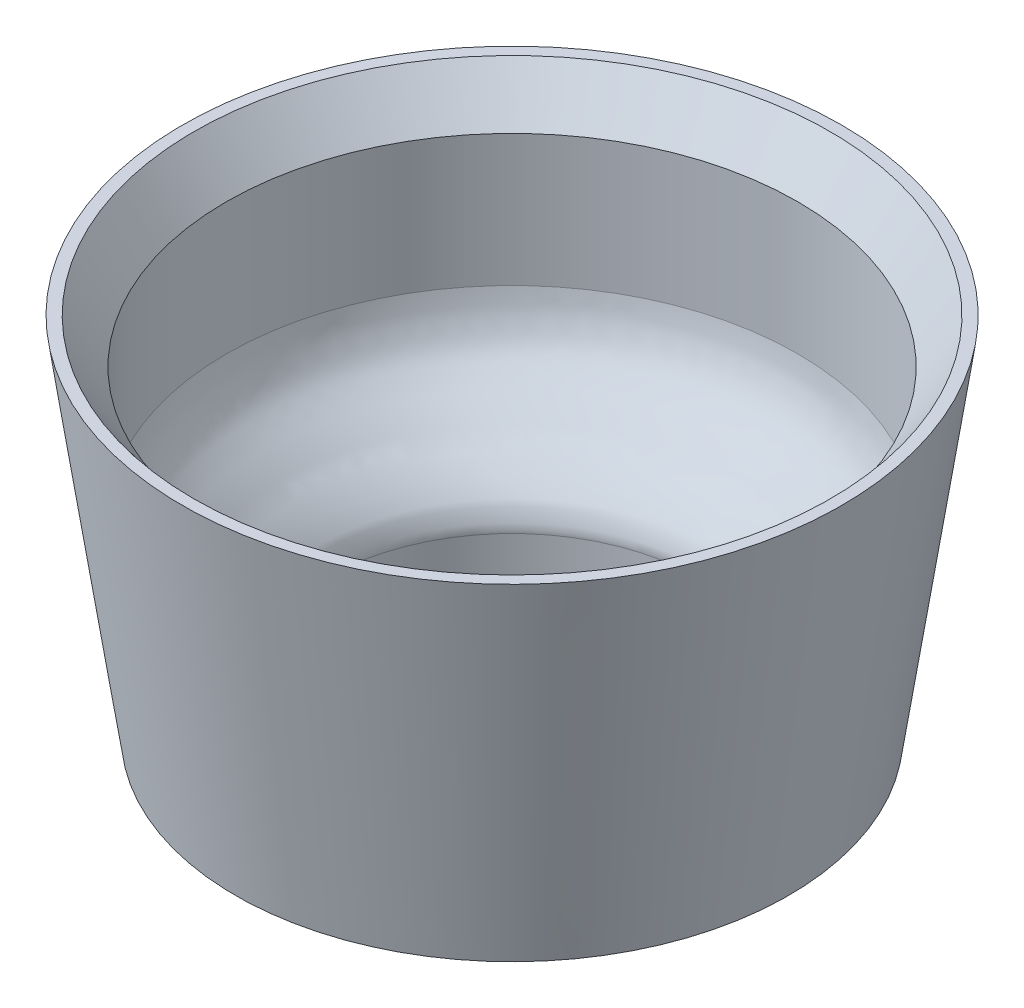
ISO-10303-21;
HEADER;
FILE_DESCRIPTION(('STEP AP214'),'2;1');
FILE_NAME('part.step','',(''),(''),'','','');
FILE_SCHEMA(('AUTOMOTIVE_DESIGN { 1 0 10303 214 1 1 1 1 }'));
ENDSEC;
DATA;
#1=APPLICATION_CONTEXT('core data for automotive mechanical design processes');
#2=APPLICATION_PROTOCOL_DEFINITION('international standard','automotive_design',2000,#1);
#3=PRODUCT_CONTEXT('',#1,'mechanical');
#4=PRODUCT('Part','Part','',(#3));
#5=PRODUCT_RELATED_PRODUCT_CATEGORY('part','',(#4));
#6=PRODUCT_DEFINITION_FORMATION('','',#4);
#7=PRODUCT_DEFINITION_CONTEXT('part definition',#1,'design');
#8=PRODUCT_DEFINITION('design','',#6,#7);
#9=PRODUCT_DEFINITION_SHAPE('','',#8);
#10=(LENGTH_UNIT() NAMED_UNIT(*) SI_UNIT(.MILLI.,.METRE.));
#11=(NAMED_UNIT(*) PLANE_ANGLE_UNIT() SI_UNIT($,.RADIAN.));
#12=(NAMED_UNIT(*) SI_UNIT($,.STERADIAN.) SOLID_ANGLE_UNIT());
#13=UNCERTAINTY_MEASURE_WITH_UNIT(LENGTH_MEASURE(1.E-05),#10,'distance_accuracy_value','');
#14=(GEOMETRIC_REPRESENTATION_CONTEXT(3) GLOBAL_UNCERTAINTY_ASSIGNED_CONTEXT((#13)) GLOBAL_UNIT_ASSIGNED_CONTEXT((#10,
#11,#12)) REPRESENTATION_CONTEXT('',''));
#15=CARTESIAN_POINT('',(0.,0.,0.));
#16=DIRECTION('',(0.,0.,1.));
#17=DIRECTION('',(1.,0.,0.));
#18=AXIS2_PLACEMENT_3D('',#15,#16,#17);
#19=CARTESIAN_POINT('',(0.,295.540718441883,-40.5476747547925));
#20=CARTESIAN_POINT('',(0.,295.012709619523,-40.4477404661589));
#21=CARTESIAN_POINT('',(0.,293.97075762208,-40.2927773532569));
#22=CARTESIAN_POINT('',(0.,292.587532756122,-39.9308897560611));
#23=CARTESIAN_POINT('',(0.,291.58145136226,-39.5161864167623));
#24=CARTESIAN_POINT('',(0.,290.578047282884,-39.108370783691));
#25=CARTESIAN_POINT('',(0.,289.316986820611,-38.4396980559672));
#26=CARTESIAN_POINT('',(0.,288.032583080572,-37.331416088062));
#27=CARTESIAN_POINT('',(0.,287.115418475381,-36.3683638828485));
#28=CARTESIAN_POINT('',(0.,286.340079674161,-35.6302312659731));
#29=CARTESIAN_POINT('',(0.,285.762737127398,-35.016472727917));
#30=CARTESIAN_POINT('',(0.,285.24716922452,-34.3942597967322));
#31=CARTESIAN_POINT('',(0.,284.556558000638,-33.6355246627479));
#32=CARTESIAN_POINT('',(0.,283.771384038908,-32.9203613347517));
#33=CARTESIAN_POINT('',(0.,282.986073937038,-32.1296519022716));
#34=CARTESIAN_POINT('',(0.,282.459482323663,-31.4852417847114));
#35=CARTESIAN_POINT('',(0.,281.963476573619,-30.9149972093189));
#36=CARTESIAN_POINT('',(0.,281.391298159735,-30.3717003470602));
#37=CARTESIAN_POINT('',(0.,280.804626850674,-29.7827961595503));
#38=CARTESIAN_POINT('',(0.,280.262154528678,-29.2275845818967));
#39=CARTESIAN_POINT('',(0.,279.674853682106,-28.7247526186086));
#40=CARTESIAN_POINT('',(0.,279.039651715806,-28.180386253933));
#41=CARTESIAN_POINT('',(0.,278.470209992177,-27.6518383156236));
#42=CARTESIAN_POINT('',(0.,277.876839187046,-27.3081459356275));
#43=CARTESIAN_POINT('',(0.,277.127164256489,-26.995230080683));
#44=CARTESIAN_POINT('',(0.,276.164510632416,-26.5979526177772));
#45=CARTESIAN_POINT('',(0.,275.470548140739,-26.4648115829102));
#46=CARTESIAN_POINT('',(0.,274.996982716808,-26.5077562004189));
#47=B_SPLINE_CURVE_WITH_KNOTS('',3,(#19,#20,#21,#22,#23,#24,#25,#26,#27,#28,#29,#30,#31,#32,#33,
#34,#35,#36,#37,#38,#39,#40,#41,#42,#43,#44,#45,#46),.UNSPECIFIED.,.F.,.F.,(4,1,1,1,1,1,1,1,1,1,
1,1,1,1,1,1,1,1,1,1,1,1,1,1,1,4),(0.,0.0625440482121065,0.125088096424213,0.156360120530266,
0.187632144636319,0.250176192848426,0.312720241060532,0.375264289272639,0.406536313378692,
0.437808337484745,0.469080361590798,0.500352385696852,0.562896433908958,0.594168458015011,
0.625440482121065,0.656712506227118,0.687984530333171,0.719256554439224,0.750528578545278,
0.781800602651331,0.813072626757384,0.844344650863437,0.87561667496949,0.906888699075544,
0.938160723181597,1.0007047713937),.UNSPECIFIED.);
#48=CARTESIAN_POINT('',(0.,0.,0.));
#49=DIRECTION('',(0.,-1.,0.));
#50=AXIS1_PLACEMENT('',#48,#49);
#51=SURFACE_OF_REVOLUTION('',#47,#50);
#52=CARTESIAN_POINT('',(0.,274.996982716808,8.70010388948478E-13));
#53=DIRECTION('',(0.,-1.,0.));
#54=DIRECTION('',(0.,0.,-1.));
#55=AXIS2_PLACEMENT_3D('',#52,#53,#54);
#56=CIRCLE('',#55,26.5077562004197);
#57=CARTESIAN_POINT('',(0.,274.996982716808,-26.5077562004189));
#58=VERTEX_POINT('',#57);
#59=EDGE_CURVE('E52',#58,#58,#56,.T.);
#60=ORIENTED_EDGE('',*,*,#59,.T.);
#61=EDGE_LOOP('',(#60));
#62=FACE_BOUND('',#61,.T.);
#63=CARTESIAN_POINT('',(0.,295.540718441883,9.35004787548966E-13));
#64=DIRECTION('',(0.,-1.,0.));
#65=DIRECTION('',(0.,0.,-1.));
#66=AXIS2_PLACEMENT_3D('',#63,#64,#65);
#67=CIRCLE('',#66,40.5476747547934);
#68=CARTESIAN_POINT('',(0.,295.540718441883,-40.5476747547925));
#69=VERTEX_POINT('',#68);
#70=EDGE_CURVE('E10',#69,#69,#67,.T.);
#71=ORIENTED_EDGE('',*,*,#70,.F.);
#72=EDGE_LOOP('',(#71));
#73=FACE_BOUND('',#72,.T.);
#74=ADVANCED_FACE('F32',(#62,#73),#51,.F.);
#75=CARTESIAN_POINT('',(0.,0.,0.));
#76=DIRECTION('',(0.,-1.,0.));
#77=DIRECTION('',(0.,0.,-1.));
#78=AXIS2_PLACEMENT_3D('',#75,#76,#77);
#79=CYLINDRICAL_SURFACE('',#78,40.5476747547935);
#80=CARTESIAN_POINT('',(0.,314.23861894093,1.21639691948947E-12));
#81=DIRECTION('',(0.,1.,0.));
#82=DIRECTION('',(0.,0.,1.));
#83=AXIS2_PLACEMENT_3D('',#80,#81,#82);
#84=CIRCLE('',#83,40.5476747547937);
#85=CARTESIAN_POINT('',(0.,314.238618940931,40.5476747547949));
#86=VERTEX_POINT('',#85);
#87=EDGE_CURVE('E58',#86,#86,#84,.T.);
#88=ORIENTED_EDGE('',*,*,#87,.T.);
#89=EDGE_LOOP('',(#88));
#90=FACE_BOUND('',#89,.T.);
#91=ORIENTED_EDGE('',*,*,#70,.T.);
#92=EDGE_LOOP('',(#91));
#93=FACE_BOUND('',#92,.T.);
#94=ADVANCED_FACE('F83',(#90,#93),#79,.F.);
#95=CARTESIAN_POINT('',(0.,320.561079728492,-44.1979491924324));
#96=DIRECTION('',(0.,1.,0.));
#97=DIRECTION('',(0.,0.,1.));
#98=AXIS2_PLACEMENT_3D('',#95,#96,#97);
#99=PLANE('',#98);
#100=CARTESIAN_POINT('',(0.,320.561079728492,1.83522502169681E-12));
#101=DIRECTION('',(0.,1.,0.));
#102=DIRECTION('',(0.,0.,1.));
#103=AXIS2_PLACEMENT_3D('',#100,#101,#102);
#104=CIRCLE('',#103,45.1412113986033);
#105=CARTESIAN_POINT('',(0.,320.561079728491,45.1412113986051));
#106=VERTEX_POINT('',#105);
#107=EDGE_CURVE('E36',#106,#106,#104,.F.);
#108=ORIENTED_EDGE('',*,*,#107,.T.);
#109=EDGE_LOOP('',(#108));
#110=FACE_BOUND('',#109,.T.);
#111=CARTESIAN_POINT('',(0.,320.561079728492,1.01416192607296E-12));
#112=DIRECTION('',(0.,-1.,0.));
#113=DIRECTION('',(0.,0.,-1.));
#114=AXIS2_PLACEMENT_3D('',#111,#112,#113);
#115=CIRCLE('',#114,46.7648040804644);
#116=CARTESIAN_POINT('',(0.,320.561079728492,-46.7648040804634));
#117=VERTEX_POINT('',#116);
#118=EDGE_CURVE('E40',#117,#117,#115,.T.);
#119=ORIENTED_EDGE('',*,*,#118,.F.);
#120=EDGE_LOOP('',(#119));
#121=FACE_BOUND('',#120,.T.);
#122=ADVANCED_FACE('F68',(#110,#121),#99,.T.);
#123=CARTESIAN_POINT('',(0.,268.84861894093,8.50558756035268E-13));
#124=DIRECTION('',(0.,1.,0.));
#125=DIRECTION('',(0.,0.,1.));
#126=AXIS2_PLACEMENT_3D('',#123,#124,#125);
#127=CONICAL_SURFACE('',#126,39.220771912562,0.144862327915552);
#128=ORIENTED_EDGE('',*,*,#118,.T.);
#129=EDGE_LOOP('',(#128));
#130=FACE_BOUND('',#129,.T.);
#131=CARTESIAN_POINT('',(0.,268.84861894093,8.50558756035268E-13));
#132=DIRECTION('',(0.,-1.,0.));
#133=DIRECTION('',(0.,0.,-1.));
#134=AXIS2_PLACEMENT_3D('',#131,#132,#133);
#135=CIRCLE('',#134,39.220771912562);
#136=CARTESIAN_POINT('',(0.,268.84861894093,-39.2207719125611));
#137=VERTEX_POINT('',#136);
#138=EDGE_CURVE('E44',#137,#137,#135,.T.);
#139=ORIENTED_EDGE('',*,*,#138,.F.);
#140=EDGE_LOOP('',(#139));
#141=FACE_BOUND('',#140,.T.);
#142=ADVANCED_FACE('F94',(#130,#141),#127,.T.);
#143=CARTESIAN_POINT('',(0.,268.84861894093,-39.2207719125611));
#144=DIRECTION('',(0.,-1.,0.));
#145=DIRECTION('',(0.,0.,-1.));
#146=AXIS2_PLACEMENT_3D('',#143,#144,#145);
#147=PLANE('',#146);
#148=ORIENTED_EDGE('',*,*,#138,.T.);
#149=EDGE_LOOP('',(#148));
#150=FACE_BOUND('',#149,.T.);
#151=CARTESIAN_POINT('',(0.,268.84861894093,8.50558756035268E-13));
#152=DIRECTION('',(0.,-1.,0.));
#153=DIRECTION('',(0.,0.,-1.));
#154=AXIS2_PLACEMENT_3D('',#151,#152,#153);
#155=CIRCLE('',#154,26.5077562004196);
#156=CARTESIAN_POINT('',(0.,268.84861894093,-26.5077562004188));
#157=VERTEX_POINT('',#156);
#158=EDGE_CURVE('E49',#157,#157,#155,.T.);
#159=ORIENTED_EDGE('',*,*,#158,.F.);
#160=EDGE_LOOP('',(#159));
#161=FACE_BOUND('',#160,.T.);
#162=ADVANCED_FACE('F79',(#150,#161),#147,.T.);
#163=CARTESIAN_POINT('',(0.,0.,0.));
#164=DIRECTION('',(0.,-1.,0.));
#165=DIRECTION('',(0.,0.,-1.));
#166=AXIS2_PLACEMENT_3D('',#163,#164,#165);
#167=CYLINDRICAL_SURFACE('',#166,26.5077562004197);
#168=ORIENTED_EDGE('',*,*,#158,.T.);
#169=EDGE_LOOP('',(#168));
#170=FACE_BOUND('',#169,.T.);
#171=ORIENTED_EDGE('',*,*,#59,.F.);
#172=EDGE_LOOP('',(#171));
#173=FACE_BOUND('',#172,.T.);
#174=ADVANCED_FACE('F74',(#170,#173),#167,.F.);
#175=CARTESIAN_POINT('',(0.,314.23861894093,1.21639691948947E-12));
#176=DIRECTION('',(0.,1.,0.));
#177=DIRECTION('',(0.,0.,1.));
#178=AXIS2_PLACEMENT_3D('',#175,#176,#177);
#179=CONICAL_SURFACE('',#178,40.5476747547937,0.628318530717941);
#180=ORIENTED_EDGE('',*,*,#107,.F.);
#181=EDGE_LOOP('',(#180));
#182=FACE_BOUND('',#181,.T.);
#183=ORIENTED_EDGE('',*,*,#87,.F.);
#184=EDGE_LOOP('',(#183));
#185=FACE_BOUND('',#184,.T.);
#186=ADVANCED_FACE('F71',(#182,#185),#179,.F.);
#187=CLOSED_SHELL('',(#74,#94,#122,#142,#162,#174,#186));
#188=MANIFOLD_SOLID_BREP('B2',#187);
#189=ADVANCED_BREP_SHAPE_REPRESENTATION('',(#18,#188),#14);
#190=SHAPE_DEFINITION_REPRESENTATION(#9,#189);
ENDSEC;
END-ISO-10303-21;
